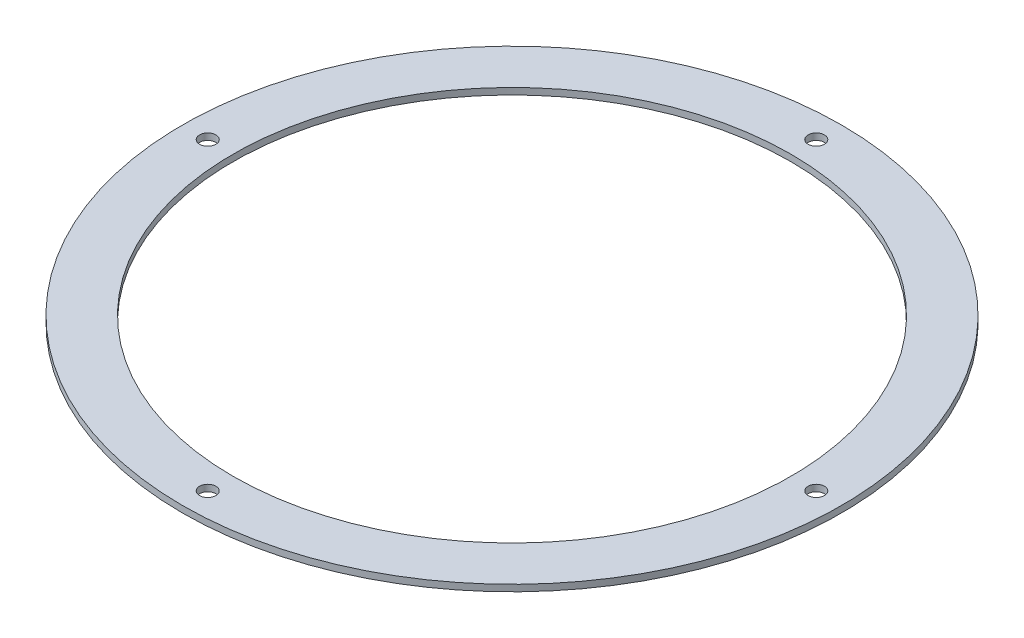
ISO-10303-21;
HEADER;
FILE_DESCRIPTION(('STEP AP214'),'2;1');
FILE_NAME('part.step','',(''),(''),'','','');
FILE_SCHEMA(('AUTOMOTIVE_DESIGN { 1 0 10303 214 1 1 1 1 }'));
ENDSEC;
DATA;
#1=APPLICATION_CONTEXT('core data for automotive mechanical design processes');
#2=APPLICATION_PROTOCOL_DEFINITION('international standard','automotive_design',2000,#1);
#3=PRODUCT_CONTEXT('',#1,'mechanical');
#4=PRODUCT('Part','Part','',(#3));
#5=PRODUCT_RELATED_PRODUCT_CATEGORY('part','',(#4));
#6=PRODUCT_DEFINITION_FORMATION('','',#4);
#7=PRODUCT_DEFINITION_CONTEXT('part definition',#1,'design');
#8=PRODUCT_DEFINITION('design','',#6,#7);
#9=PRODUCT_DEFINITION_SHAPE('','',#8);
#10=(LENGTH_UNIT() NAMED_UNIT(*) SI_UNIT(.MILLI.,.METRE.));
#11=(NAMED_UNIT(*) PLANE_ANGLE_UNIT() SI_UNIT($,.RADIAN.));
#12=(NAMED_UNIT(*) SI_UNIT($,.STERADIAN.) SOLID_ANGLE_UNIT());
#13=UNCERTAINTY_MEASURE_WITH_UNIT(LENGTH_MEASURE(1.E-05),#10,'distance_accuracy_value','');
#14=(GEOMETRIC_REPRESENTATION_CONTEXT(3) GLOBAL_UNCERTAINTY_ASSIGNED_CONTEXT((#13)) GLOBAL_UNIT_ASSIGNED_CONTEXT((#10,
#11,#12)) REPRESENTATION_CONTEXT('',''));
#15=CARTESIAN_POINT('',(0.,0.,0.));
#16=DIRECTION('',(0.,0.,1.));
#17=DIRECTION('',(1.,0.,0.));
#18=AXIS2_PLACEMENT_3D('',#15,#16,#17);
#19=CARTESIAN_POINT('',(93.25,2.,3.25580634847122E-13));
#20=DIRECTION('',(0.,-1.,0.));
#21=DIRECTION('',(0.,0.,-1.));
#22=AXIS2_PLACEMENT_3D('',#19,#20,#21);
#23=CYLINDRICAL_SURFACE('',#22,2.5);
#24=CARTESIAN_POINT('',(93.25,2.,3.25580634847122E-13));
#25=DIRECTION('',(0.,1.,0.));
#26=DIRECTION('',(0.,0.,1.));
#27=AXIS2_PLACEMENT_3D('',#24,#25,#26);
#28=CIRCLE('',#27,2.5);
#29=CARTESIAN_POINT('',(93.25,2.,2.50000000000033));
#30=VERTEX_POINT('',#29);
#31=EDGE_CURVE('E52',#30,#30,#28,.T.);
#32=ORIENTED_EDGE('',*,*,#31,.T.);
#33=EDGE_LOOP('',(#32));
#34=FACE_BOUND('',#33,.T.);
#35=CARTESIAN_POINT('',(93.25,0.,3.25580634847122E-13));
#36=DIRECTION('',(0.,1.,0.));
#37=DIRECTION('',(0.,0.,1.));
#38=AXIS2_PLACEMENT_3D('',#35,#36,#37);
#39=CIRCLE('',#38,2.5);
#40=CARTESIAN_POINT('',(93.25,0.,2.50000000000033));
#41=VERTEX_POINT('',#40);
#42=EDGE_CURVE('E77',#41,#41,#39,.T.);
#43=ORIENTED_EDGE('',*,*,#42,.F.);
#44=EDGE_LOOP('',(#43));
#45=FACE_BOUND('',#44,.T.);
#46=ADVANCED_FACE('F43',(#34,#45),#23,.F.);
#47=CARTESIAN_POINT('',(-6.51161269694244E-13,2.,93.25));
#48=DIRECTION('',(0.,-1.,0.));
#49=DIRECTION('',(0.,0.,-1.));
#50=AXIS2_PLACEMENT_3D('',#47,#48,#49);
#51=CYLINDRICAL_SURFACE('',#50,2.5);
#52=CARTESIAN_POINT('',(-6.51161269694244E-13,2.,93.25));
#53=DIRECTION('',(0.,1.,0.));
#54=DIRECTION('',(0.,0.,1.));
#55=AXIS2_PLACEMENT_3D('',#52,#53,#54);
#56=CIRCLE('',#55,2.5);
#57=CARTESIAN_POINT('',(-6.51161269694244E-13,2.,95.75));
#58=VERTEX_POINT('',#57);
#59=EDGE_CURVE('E58',#58,#58,#56,.T.);
#60=ORIENTED_EDGE('',*,*,#59,.T.);
#61=EDGE_LOOP('',(#60));
#62=FACE_BOUND('',#61,.T.);
#63=CARTESIAN_POINT('',(-6.51161269694244E-13,0.,93.25));
#64=DIRECTION('',(0.,1.,0.));
#65=DIRECTION('',(0.,0.,1.));
#66=AXIS2_PLACEMENT_3D('',#63,#64,#65);
#67=CIRCLE('',#66,2.5);
#68=CARTESIAN_POINT('',(-6.51161269694244E-13,0.,95.75));
#69=VERTEX_POINT('',#68);
#70=EDGE_CURVE('E74',#69,#69,#67,.T.);
#71=ORIENTED_EDGE('',*,*,#70,.F.);
#72=EDGE_LOOP('',(#71));
#73=FACE_BOUND('',#72,.T.);
#74=ADVANCED_FACE('F104',(#62,#73),#51,.F.);
#75=CARTESIAN_POINT('',(-93.25,2.,-9.76741904541367E-13));
#76=DIRECTION('',(0.,-1.,0.));
#77=DIRECTION('',(0.,0.,-1.));
#78=AXIS2_PLACEMENT_3D('',#75,#76,#77);
#79=CYLINDRICAL_SURFACE('',#78,2.5);
#80=CARTESIAN_POINT('',(-93.25,2.,-9.76741904541367E-13));
#81=DIRECTION('',(0.,1.,0.));
#82=DIRECTION('',(0.,0.,1.));
#83=AXIS2_PLACEMENT_3D('',#80,#81,#82);
#84=CIRCLE('',#83,2.5);
#85=CARTESIAN_POINT('',(-93.25,2.,2.49999999999902));
#86=VERTEX_POINT('',#85);
#87=EDGE_CURVE('E95',#86,#86,#84,.T.);
#88=ORIENTED_EDGE('',*,*,#87,.T.);
#89=EDGE_LOOP('',(#88));
#90=FACE_BOUND('',#89,.T.);
#91=CARTESIAN_POINT('',(-93.25,0.,-9.76741904541367E-13));
#92=DIRECTION('',(0.,1.,0.));
#93=DIRECTION('',(0.,0.,1.));
#94=AXIS2_PLACEMENT_3D('',#91,#92,#93);
#95=CIRCLE('',#94,2.5);
#96=CARTESIAN_POINT('',(-93.25,0.,2.49999999999902));
#97=VERTEX_POINT('',#96);
#98=EDGE_CURVE('E70',#97,#97,#95,.T.);
#99=ORIENTED_EDGE('',*,*,#98,.F.);
#100=EDGE_LOOP('',(#99));
#101=FACE_BOUND('',#100,.T.);
#102=ADVANCED_FACE('F123',(#90,#101),#79,.F.);
#103=CARTESIAN_POINT('',(0.,2.,0.));
#104=DIRECTION('',(0.,-1.,0.));
#105=DIRECTION('',(0.,0.,-1.));
#106=AXIS2_PLACEMENT_3D('',#103,#104,#105);
#107=CYLINDRICAL_SURFACE('',#106,101.);
#108=CARTESIAN_POINT('',(0.,2.,0.));
#109=DIRECTION('',(0.,1.,0.));
#110=DIRECTION('',(0.,0.,1.));
#111=AXIS2_PLACEMENT_3D('',#108,#109,#110);
#112=CIRCLE('',#111,101.);
#113=CARTESIAN_POINT('',(0.,2.,101.));
#114=VERTEX_POINT('',#113);
#115=EDGE_CURVE('E89',#114,#114,#112,.T.);
#116=ORIENTED_EDGE('',*,*,#115,.F.);
#117=EDGE_LOOP('',(#116));
#118=FACE_BOUND('',#117,.T.);
#119=CARTESIAN_POINT('',(0.,0.,0.));
#120=DIRECTION('',(0.,1.,0.));
#121=DIRECTION('',(0.,0.,1.));
#122=AXIS2_PLACEMENT_3D('',#119,#120,#121);
#123=CIRCLE('',#122,101.);
#124=CARTESIAN_POINT('',(0.,0.,101.));
#125=VERTEX_POINT('',#124);
#126=EDGE_CURVE('E66',#125,#125,#123,.T.);
#127=ORIENTED_EDGE('',*,*,#126,.T.);
#128=EDGE_LOOP('',(#127));
#129=FACE_BOUND('',#128,.T.);
#130=ADVANCED_FACE('F129',(#118,#129),#107,.T.);
#131=CARTESIAN_POINT('',(0.,2.,-93.25));
#132=DIRECTION('',(0.,-1.,0.));
#133=DIRECTION('',(0.,0.,-1.));
#134=AXIS2_PLACEMENT_3D('',#131,#132,#133);
#135=CYLINDRICAL_SURFACE('',#134,2.5);
#136=CARTESIAN_POINT('',(0.,2.,-93.25));
#137=DIRECTION('',(0.,1.,0.));
#138=DIRECTION('',(0.,0.,1.));
#139=AXIS2_PLACEMENT_3D('',#136,#137,#138);
#140=CIRCLE('',#139,2.5);
#141=CARTESIAN_POINT('',(0.,2.,-90.75));
#142=VERTEX_POINT('',#141);
#143=EDGE_CURVE('E84',#142,#142,#140,.T.);
#144=ORIENTED_EDGE('',*,*,#143,.T.);
#145=EDGE_LOOP('',(#144));
#146=FACE_BOUND('',#145,.T.);
#147=CARTESIAN_POINT('',(0.,0.,-93.25));
#148=DIRECTION('',(0.,1.,0.));
#149=DIRECTION('',(0.,0.,1.));
#150=AXIS2_PLACEMENT_3D('',#147,#148,#149);
#151=CIRCLE('',#150,2.5);
#152=CARTESIAN_POINT('',(0.,0.,-90.75));
#153=VERTEX_POINT('',#152);
#154=EDGE_CURVE('E62',#153,#153,#151,.T.);
#155=ORIENTED_EDGE('',*,*,#154,.F.);
#156=EDGE_LOOP('',(#155));
#157=FACE_BOUND('',#156,.T.);
#158=ADVANCED_FACE('F45',(#146,#157),#135,.F.);
#159=CARTESIAN_POINT('',(0.,2.,0.));
#160=DIRECTION('',(0.,-1.,0.));
#161=DIRECTION('',(0.,0.,-1.));
#162=AXIS2_PLACEMENT_3D('',#159,#160,#161);
#163=CYLINDRICAL_SURFACE('',#162,85.5);
#164=CARTESIAN_POINT('',(0.,2.,0.));
#165=DIRECTION('',(0.,1.,0.));
#166=DIRECTION('',(0.,0.,1.));
#167=AXIS2_PLACEMENT_3D('',#164,#165,#166);
#168=CIRCLE('',#167,85.5);
#169=CARTESIAN_POINT('',(0.,2.,85.5));
#170=VERTEX_POINT('',#169);
#171=EDGE_CURVE('E10',#170,#170,#168,.T.);
#172=ORIENTED_EDGE('',*,*,#171,.T.);
#173=EDGE_LOOP('',(#172));
#174=FACE_BOUND('',#173,.T.);
#175=CARTESIAN_POINT('',(0.,0.,0.));
#176=DIRECTION('',(0.,1.,0.));
#177=DIRECTION('',(0.,0.,1.));
#178=AXIS2_PLACEMENT_3D('',#175,#176,#177);
#179=CIRCLE('',#178,85.5);
#180=CARTESIAN_POINT('',(0.,0.,85.5));
#181=VERTEX_POINT('',#180);
#182=EDGE_CURVE('E47',#181,#181,#179,.T.);
#183=ORIENTED_EDGE('',*,*,#182,.F.);
#184=EDGE_LOOP('',(#183));
#185=FACE_BOUND('',#184,.T.);
#186=ADVANCED_FACE('F111',(#174,#185),#163,.F.);
#187=CARTESIAN_POINT('',(0.,2.,0.));
#188=DIRECTION('',(0.,1.,0.));
#189=DIRECTION('',(0.,0.,1.));
#190=AXIS2_PLACEMENT_3D('',#187,#188,#189);
#191=PLANE('',#190);
#192=ORIENTED_EDGE('',*,*,#143,.F.);
#193=EDGE_LOOP('',(#192));
#194=FACE_BOUND('',#193,.T.);
#195=ORIENTED_EDGE('',*,*,#115,.T.);
#196=EDGE_LOOP('',(#195));
#197=FACE_BOUND('',#196,.T.);
#198=ORIENTED_EDGE('',*,*,#87,.F.);
#199=EDGE_LOOP('',(#198));
#200=FACE_BOUND('',#199,.T.);
#201=ORIENTED_EDGE('',*,*,#59,.F.);
#202=EDGE_LOOP('',(#201));
#203=FACE_BOUND('',#202,.T.);
#204=ORIENTED_EDGE('',*,*,#31,.F.);
#205=EDGE_LOOP('',(#204));
#206=FACE_BOUND('',#205,.T.);
#207=ORIENTED_EDGE('',*,*,#171,.F.);
#208=EDGE_LOOP('',(#207));
#209=FACE_BOUND('',#208,.T.);
#210=ADVANCED_FACE('F107',(#194,#197,#200,#203,#206,#209),#191,.T.);
#211=CARTESIAN_POINT('',(0.,0.,0.));
#212=DIRECTION('',(0.,1.,0.));
#213=DIRECTION('',(0.,0.,1.));
#214=AXIS2_PLACEMENT_3D('',#211,#212,#213);
#215=PLANE('',#214);
#216=ORIENTED_EDGE('',*,*,#154,.T.);
#217=EDGE_LOOP('',(#216));
#218=FACE_BOUND('',#217,.T.);
#219=ORIENTED_EDGE('',*,*,#126,.F.);
#220=EDGE_LOOP('',(#219));
#221=FACE_BOUND('',#220,.T.);
#222=ORIENTED_EDGE('',*,*,#98,.T.);
#223=EDGE_LOOP('',(#222));
#224=FACE_BOUND('',#223,.T.);
#225=ORIENTED_EDGE('',*,*,#70,.T.);
#226=EDGE_LOOP('',(#225));
#227=FACE_BOUND('',#226,.T.);
#228=ORIENTED_EDGE('',*,*,#42,.T.);
#229=EDGE_LOOP('',(#228));
#230=FACE_BOUND('',#229,.T.);
#231=ORIENTED_EDGE('',*,*,#182,.T.);
#232=EDGE_LOOP('',(#231));
#233=FACE_BOUND('',#232,.T.);
#234=ADVANCED_FACE('F110',(#218,#221,#224,#227,#230,#233),#215,.F.);
#235=CLOSED_SHELL('',(#46,#74,#102,#130,#158,#186,#210,#234));
#236=MANIFOLD_SOLID_BREP('B2',#235);
#237=ADVANCED_BREP_SHAPE_REPRESENTATION('',(#18,#236),#14);
#238=SHAPE_DEFINITION_REPRESENTATION(#9,#237);
ENDSEC;
END-ISO-10303-21;
